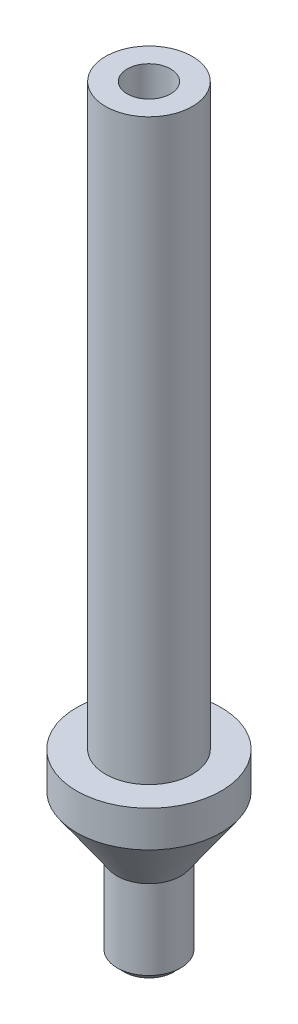
ISO-10303-21;
HEADER;
FILE_DESCRIPTION(('STEP AP214'),'2;1');
FILE_NAME('part.step','',(''),(''),'','','');
FILE_SCHEMA(('AUTOMOTIVE_DESIGN { 1 0 10303 214 1 1 1 1 }'));
ENDSEC;
DATA;
#1=APPLICATION_CONTEXT('core data for automotive mechanical design processes');
#2=APPLICATION_PROTOCOL_DEFINITION('international standard','automotive_design',2000,#1);
#3=PRODUCT_CONTEXT('',#1,'mechanical');
#4=PRODUCT('Part','Part','',(#3));
#5=PRODUCT_RELATED_PRODUCT_CATEGORY('part','',(#4));
#6=PRODUCT_DEFINITION_FORMATION('','',#4);
#7=PRODUCT_DEFINITION_CONTEXT('part definition',#1,'design');
#8=PRODUCT_DEFINITION('design','',#6,#7);
#9=PRODUCT_DEFINITION_SHAPE('','',#8);
#10=(LENGTH_UNIT() NAMED_UNIT(*) SI_UNIT(.MILLI.,.METRE.));
#11=(NAMED_UNIT(*) PLANE_ANGLE_UNIT() SI_UNIT($,.RADIAN.));
#12=(NAMED_UNIT(*) SI_UNIT($,.STERADIAN.) SOLID_ANGLE_UNIT());
#13=UNCERTAINTY_MEASURE_WITH_UNIT(LENGTH_MEASURE(1.E-05),#10,'distance_accuracy_value','');
#14=(GEOMETRIC_REPRESENTATION_CONTEXT(3) GLOBAL_UNCERTAINTY_ASSIGNED_CONTEXT((#13)) GLOBAL_UNIT_ASSIGNED_CONTEXT((#10,
#11,#12)) REPRESENTATION_CONTEXT('',''));
#15=CARTESIAN_POINT('',(0.,0.,0.));
#16=DIRECTION('',(0.,0.,1.));
#17=DIRECTION('',(1.,0.,0.));
#18=AXIS2_PLACEMENT_3D('',#15,#16,#17);
#19=CARTESIAN_POINT('',(0.,0.,0.));
#20=DIRECTION('',(0.,1.,0.));
#21=DIRECTION('',(0.,0.,1.));
#22=AXIS2_PLACEMENT_3D('',#19,#20,#21);
#23=CYLINDRICAL_SURFACE('',#22,1.075);
#24=CARTESIAN_POINT('',(0.,0.,0.));
#25=DIRECTION('',(0.,1.,0.));
#26=DIRECTION('',(0.,0.,1.));
#27=AXIS2_PLACEMENT_3D('',#24,#25,#26);
#28=CIRCLE('',#27,1.075);
#29=CARTESIAN_POINT('',(0.,0.,1.075));
#30=VERTEX_POINT('',#29);
#31=EDGE_CURVE('E63',#30,#30,#28,.T.);
#32=ORIENTED_EDGE('',*,*,#31,.F.);
#33=EDGE_LOOP('',(#32));
#34=FACE_BOUND('',#33,.T.);
#35=CARTESIAN_POINT('',(0.,32.5,0.));
#36=DIRECTION('',(0.,1.,0.));
#37=DIRECTION('',(0.,0.,1.));
#38=AXIS2_PLACEMENT_3D('',#35,#36,#37);
#39=CIRCLE('',#38,1.075);
#40=CARTESIAN_POINT('',(0.,32.5,1.075));
#41=VERTEX_POINT('',#40);
#42=EDGE_CURVE('E65',#41,#41,#39,.F.);
#43=ORIENTED_EDGE('',*,*,#42,.F.);
#44=EDGE_LOOP('',(#43));
#45=FACE_BOUND('',#44,.T.);
#46=ADVANCED_FACE('F39',(#34,#45),#23,.F.);
#47=CARTESIAN_POINT('',(0.,0.,0.));
#48=DIRECTION('',(0.,-1.,0.));
#49=DIRECTION('',(0.,0.,-1.));
#50=AXIS2_PLACEMENT_3D('',#47,#48,#49);
#51=PLANE('',#50);
#52=CARTESIAN_POINT('',(0.,0.,0.));
#53=DIRECTION('',(0.,-1.,0.));
#54=DIRECTION('',(0.,0.,-1.));
#55=AXIS2_PLACEMENT_3D('',#52,#53,#54);
#56=CIRCLE('',#55,1.7);
#57=CARTESIAN_POINT('',(0.,0.,-1.7));
#58=VERTEX_POINT('',#57);
#59=EDGE_CURVE('E10',#58,#58,#56,.T.);
#60=ORIENTED_EDGE('',*,*,#59,.T.);
#61=EDGE_LOOP('',(#60));
#62=FACE_BOUND('',#61,.T.);
#63=ORIENTED_EDGE('',*,*,#31,.T.);
#64=EDGE_LOOP('',(#63));
#65=FACE_BOUND('',#64,.T.);
#66=ADVANCED_FACE('F99',(#62,#65),#51,.T.);
#67=CARTESIAN_POINT('',(0.,52.5,0.));
#68=DIRECTION('',(0.,1.,0.));
#69=DIRECTION('',(0.,0.,1.));
#70=AXIS2_PLACEMENT_3D('',#67,#68,#69);
#71=CYLINDRICAL_SURFACE('',#70,2.2);
#72=CARTESIAN_POINT('',(0.,0.5,0.));
#73=DIRECTION('',(0.,-1.,0.));
#74=DIRECTION('',(0.,0.,-1.));
#75=AXIS2_PLACEMENT_3D('',#72,#73,#74);
#76=CIRCLE('',#75,2.2);
#77=CARTESIAN_POINT('',(0.,0.5,-2.2));
#78=VERTEX_POINT('',#77);
#79=EDGE_CURVE('E50',#78,#78,#76,.F.);
#80=ORIENTED_EDGE('',*,*,#79,.T.);
#81=EDGE_LOOP('',(#80));
#82=FACE_BOUND('',#81,.T.);
#83=CARTESIAN_POINT('',(0.,6.00118558112213,0.));
#84=DIRECTION('',(0.,1.,0.));
#85=DIRECTION('',(0.,0.,1.));
#86=AXIS2_PLACEMENT_3D('',#83,#84,#85);
#87=CIRCLE('',#86,2.2);
#88=CARTESIAN_POINT('',(0.,6.00118558112213,2.2));
#89=VERTEX_POINT('',#88);
#90=EDGE_CURVE('E51',#89,#89,#87,.T.);
#91=ORIENTED_EDGE('',*,*,#90,.F.);
#92=EDGE_LOOP('',(#91));
#93=FACE_BOUND('',#92,.T.);
#94=ADVANCED_FACE('F106',(#82,#93),#71,.T.);
#95=CARTESIAN_POINT('',(0.,10.,0.));
#96=DIRECTION('',(0.,1.,0.));
#97=DIRECTION('',(0.,0.,1.));
#98=AXIS2_PLACEMENT_3D('',#95,#96,#97);
#99=CONICAL_SURFACE('',#98,5.,0.61086523819802);
#100=ORIENTED_EDGE('',*,*,#90,.T.);
#101=EDGE_LOOP('',(#100));
#102=FACE_BOUND('',#101,.T.);
#103=CARTESIAN_POINT('',(0.,10.,0.));
#104=DIRECTION('',(0.,1.,0.));
#105=DIRECTION('',(0.,0.,1.));
#106=AXIS2_PLACEMENT_3D('',#103,#104,#105);
#107=CIRCLE('',#106,5.);
#108=CARTESIAN_POINT('',(0.,10.,5.));
#109=VERTEX_POINT('',#108);
#110=EDGE_CURVE('E54',#109,#109,#107,.T.);
#111=ORIENTED_EDGE('',*,*,#110,.F.);
#112=EDGE_LOOP('',(#111));
#113=FACE_BOUND('',#112,.T.);
#114=ADVANCED_FACE('F125',(#102,#113),#99,.T.);
#115=CARTESIAN_POINT('',(0.,52.5,0.));
#116=DIRECTION('',(0.,1.,0.));
#117=DIRECTION('',(0.,0.,1.));
#118=AXIS2_PLACEMENT_3D('',#115,#116,#117);
#119=CYLINDRICAL_SURFACE('',#118,5.);
#120=ORIENTED_EDGE('',*,*,#110,.T.);
#121=EDGE_LOOP('',(#120));
#122=FACE_BOUND('',#121,.T.);
#123=CARTESIAN_POINT('',(0.,12.5,0.));
#124=DIRECTION('',(0.,1.,0.));
#125=DIRECTION('',(0.,0.,1.));
#126=AXIS2_PLACEMENT_3D('',#123,#124,#125);
#127=CIRCLE('',#126,5.);
#128=CARTESIAN_POINT('',(0.,12.5,5.));
#129=VERTEX_POINT('',#128);
#130=EDGE_CURVE('E66',#129,#129,#127,.T.);
#131=ORIENTED_EDGE('',*,*,#130,.F.);
#132=EDGE_LOOP('',(#131));
#133=FACE_BOUND('',#132,.T.);
#134=ADVANCED_FACE('F116',(#122,#133),#119,.T.);
#135=CARTESIAN_POINT('',(0.,12.5,5.));
#136=DIRECTION('',(0.,1.,0.));
#137=DIRECTION('',(0.,0.,1.));
#138=AXIS2_PLACEMENT_3D('',#135,#136,#137);
#139=PLANE('',#138);
#140=ORIENTED_EDGE('',*,*,#130,.T.);
#141=EDGE_LOOP('',(#140));
#142=FACE_BOUND('',#141,.T.);
#143=CARTESIAN_POINT('',(0.,12.5,0.));
#144=DIRECTION('',(0.,1.,0.));
#145=DIRECTION('',(0.,0.,1.));
#146=AXIS2_PLACEMENT_3D('',#143,#144,#145);
#147=CIRCLE('',#146,3.00000000000001);
#148=CARTESIAN_POINT('',(0.,12.5,3.00000000000001));
#149=VERTEX_POINT('',#148);
#150=EDGE_CURVE('E72',#149,#149,#147,.T.);
#151=ORIENTED_EDGE('',*,*,#150,.F.);
#152=EDGE_LOOP('',(#151));
#153=FACE_BOUND('',#152,.T.);
#154=ADVANCED_FACE('F111',(#142,#153),#139,.T.);
#155=CARTESIAN_POINT('',(0.,52.5,0.));
#156=DIRECTION('',(0.,1.,0.));
#157=DIRECTION('',(0.,0.,1.));
#158=AXIS2_PLACEMENT_3D('',#155,#156,#157);
#159=CYLINDRICAL_SURFACE('',#158,3.00000000000001);
#160=ORIENTED_EDGE('',*,*,#150,.T.);
#161=EDGE_LOOP('',(#160));
#162=FACE_BOUND('',#161,.T.);
#163=CARTESIAN_POINT('',(0.,52.5,0.));
#164=DIRECTION('',(0.,1.,0.));
#165=DIRECTION('',(0.,0.,1.));
#166=AXIS2_PLACEMENT_3D('',#163,#164,#165);
#167=CIRCLE('',#166,3.00000000000001);
#168=CARTESIAN_POINT('',(0.,52.5,3.00000000000001));
#169=VERTEX_POINT('',#168);
#170=EDGE_CURVE('E74',#169,#169,#167,.T.);
#171=ORIENTED_EDGE('',*,*,#170,.F.);
#172=EDGE_LOOP('',(#171));
#173=FACE_BOUND('',#172,.T.);
#174=ADVANCED_FACE('F112',(#162,#173),#159,.T.);
#175=CARTESIAN_POINT('',(0.,52.5,3.00000000000001));
#176=DIRECTION('',(0.,1.,0.));
#177=DIRECTION('',(0.,0.,1.));
#178=AXIS2_PLACEMENT_3D('',#175,#176,#177);
#179=PLANE('',#178);
#180=CARTESIAN_POINT('',(0.,52.5,0.));
#181=DIRECTION('',(0.,1.,0.));
#182=DIRECTION('',(0.,0.,1.));
#183=AXIS2_PLACEMENT_3D('',#180,#181,#182);
#184=CIRCLE('',#183,1.5);
#185=CARTESIAN_POINT('',(0.,52.5,1.5));
#186=VERTEX_POINT('',#185);
#187=EDGE_CURVE('E59',#186,#186,#184,.F.);
#188=ORIENTED_EDGE('',*,*,#187,.T.);
#189=EDGE_LOOP('',(#188));
#190=FACE_BOUND('',#189,.T.);
#191=ORIENTED_EDGE('',*,*,#170,.T.);
#192=EDGE_LOOP('',(#191));
#193=FACE_BOUND('',#192,.T.);
#194=ADVANCED_FACE('F92',(#190,#193),#179,.T.);
#195=CARTESIAN_POINT('',(0.,32.5,0.));
#196=DIRECTION('',(0.,1.,0.));
#197=DIRECTION('',(0.,0.,1.));
#198=AXIS2_PLACEMENT_3D('',#195,#196,#197);
#199=PLANE('',#198);
#200=CARTESIAN_POINT('',(0.,32.5,0.));
#201=DIRECTION('',(0.,1.,0.));
#202=DIRECTION('',(0.,0.,1.));
#203=AXIS2_PLACEMENT_3D('',#200,#201,#202);
#204=CIRCLE('',#203,1.5);
#205=CARTESIAN_POINT('',(0.,32.5,1.5));
#206=VERTEX_POINT('',#205);
#207=EDGE_CURVE('E64',#206,#206,#204,.T.);
#208=ORIENTED_EDGE('',*,*,#207,.T.);
#209=EDGE_LOOP('',(#208));
#210=FACE_BOUND('',#209,.T.);
#211=ORIENTED_EDGE('',*,*,#42,.T.);
#212=EDGE_LOOP('',(#211));
#213=FACE_BOUND('',#212,.T.);
#214=ADVANCED_FACE('F85',(#210,#213),#199,.T.);
#215=CARTESIAN_POINT('',(0.,52.5706678235665,0.));
#216=DIRECTION('',(0.,-1.,0.));
#217=DIRECTION('',(0.,0.,-1.));
#218=AXIS2_PLACEMENT_3D('',#215,#216,#217);
#219=CYLINDRICAL_SURFACE('',#218,1.5);
#220=ORIENTED_EDGE('',*,*,#187,.F.);
#221=EDGE_LOOP('',(#220));
#222=FACE_BOUND('',#221,.T.);
#223=ORIENTED_EDGE('',*,*,#207,.F.);
#224=EDGE_LOOP('',(#223));
#225=FACE_BOUND('',#224,.T.);
#226=ADVANCED_FACE('F82',(#222,#225),#219,.F.);
#227=CARTESIAN_POINT('',(0.,0.5,0.));
#228=DIRECTION('',(0.,1.,0.));
#229=DIRECTION('',(0.,0.,1.));
#230=AXIS2_PLACEMENT_3D('',#227,#228,#229);
#231=CONICAL_SURFACE('',#230,2.2,0.785398163397448);
#232=ORIENTED_EDGE('',*,*,#59,.F.);
#233=EDGE_LOOP('',(#232));
#234=FACE_BOUND('',#233,.T.);
#235=ORIENTED_EDGE('',*,*,#79,.F.);
#236=EDGE_LOOP('',(#235));
#237=FACE_BOUND('',#236,.T.);
#238=ADVANCED_FACE('F45',(#234,#237),#231,.T.);
#239=CLOSED_SHELL('',(#46,#66,#94,#114,#134,#154,#174,#194,#214,#226,#238));
#240=MANIFOLD_SOLID_BREP('B2',#239);
#241=ADVANCED_BREP_SHAPE_REPRESENTATION('',(#18,#240),#14);
#242=SHAPE_DEFINITION_REPRESENTATION(#9,#241);
ENDSEC;
END-ISO-10303-21;
